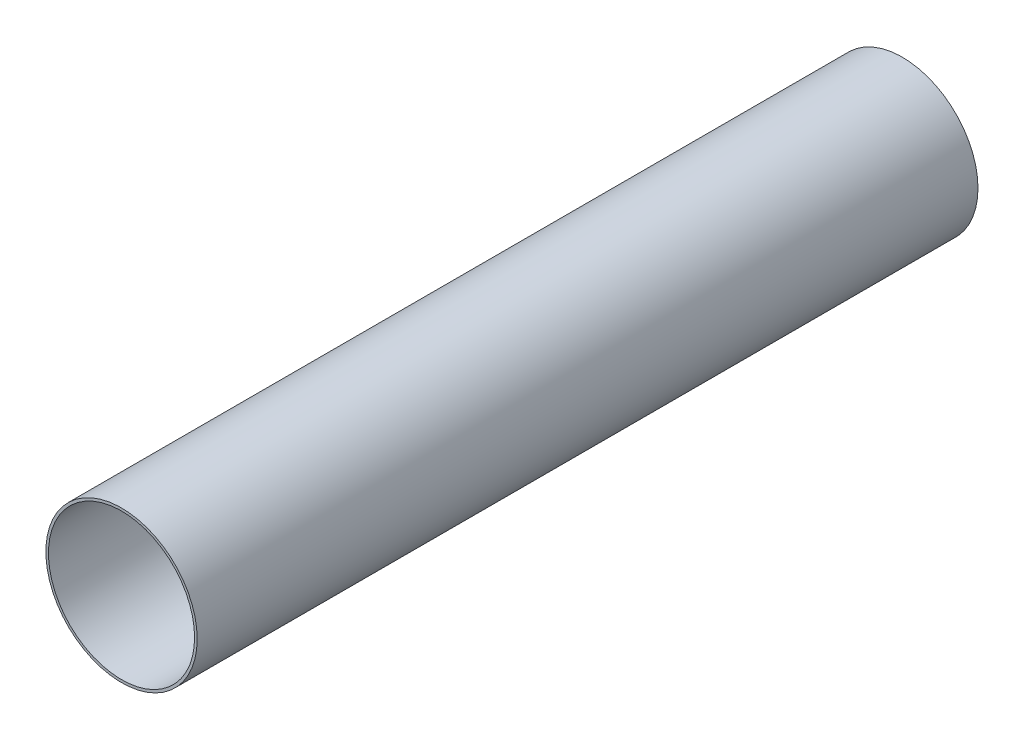
ISO-10303-21;
HEADER;
FILE_DESCRIPTION(('STEP AP214'),'2;1');
FILE_NAME('part.step','',(''),(''),'','','');
FILE_SCHEMA(('AUTOMOTIVE_DESIGN { 1 0 10303 214 1 1 1 1 }'));
ENDSEC;
DATA;
#1=APPLICATION_CONTEXT('core data for automotive mechanical design processes');
#2=APPLICATION_PROTOCOL_DEFINITION('international standard','automotive_design',2000,#1);
#3=PRODUCT_CONTEXT('',#1,'mechanical');
#4=PRODUCT('Part','Part','',(#3));
#5=PRODUCT_RELATED_PRODUCT_CATEGORY('part','',(#4));
#6=PRODUCT_DEFINITION_FORMATION('','',#4);
#7=PRODUCT_DEFINITION_CONTEXT('part definition',#1,'design');
#8=PRODUCT_DEFINITION('design','',#6,#7);
#9=PRODUCT_DEFINITION_SHAPE('','',#8);
#10=(LENGTH_UNIT() NAMED_UNIT(*) SI_UNIT(.MILLI.,.METRE.));
#11=(NAMED_UNIT(*) PLANE_ANGLE_UNIT() SI_UNIT($,.RADIAN.));
#12=(NAMED_UNIT(*) SI_UNIT($,.STERADIAN.) SOLID_ANGLE_UNIT());
#13=UNCERTAINTY_MEASURE_WITH_UNIT(LENGTH_MEASURE(1.E-05),#10,'distance_accuracy_value','');
#14=(GEOMETRIC_REPRESENTATION_CONTEXT(3) GLOBAL_UNCERTAINTY_ASSIGNED_CONTEXT((#13)) GLOBAL_UNIT_ASSIGNED_CONTEXT((#10,
#11,#12)) REPRESENTATION_CONTEXT('',''));
#15=CARTESIAN_POINT('',(0.,0.,0.));
#16=DIRECTION('',(0.,0.,1.));
#17=DIRECTION('',(1.,0.,0.));
#18=AXIS2_PLACEMENT_3D('',#15,#16,#17);
#19=CARTESIAN_POINT('',(0.,0.,1500.));
#20=DIRECTION('',(0.,0.,1.));
#21=DIRECTION('',(1.,0.,0.));
#22=AXIS2_PLACEMENT_3D('',#19,#20,#21);
#23=PLANE('',#22);
#24=CARTESIAN_POINT('',(0.,0.,1500.));
#25=DIRECTION('',(0.,0.,1.));
#26=DIRECTION('',(1.,0.,0.));
#27=AXIS2_PLACEMENT_3D('',#24,#25,#26);
#28=CIRCLE('',#27,145.37);
#29=CARTESIAN_POINT('',(145.37,0.,1500.));
#30=VERTEX_POINT('',#29);
#31=EDGE_CURVE('E10',#30,#30,#28,.T.);
#32=ORIENTED_EDGE('',*,*,#31,.T.);
#33=EDGE_LOOP('',(#32));
#34=FACE_BOUND('',#33,.T.);
#35=CARTESIAN_POINT('',(0.,0.,1500.));
#36=DIRECTION('',(0.,0.,1.));
#37=DIRECTION('',(1.,0.,0.));
#38=AXIS2_PLACEMENT_3D('',#35,#36,#37);
#39=CIRCLE('',#38,140.37);
#40=CARTESIAN_POINT('',(140.37,0.,1500.));
#41=VERTEX_POINT('',#40);
#42=EDGE_CURVE('E56',#41,#41,#39,.T.);
#43=ORIENTED_EDGE('',*,*,#42,.F.);
#44=EDGE_LOOP('',(#43));
#45=FACE_BOUND('',#44,.T.);
#46=ADVANCED_FACE('F43',(#34,#45),#23,.T.);
#47=CARTESIAN_POINT('',(0.,0.,0.));
#48=DIRECTION('',(0.,0.,1.));
#49=DIRECTION('',(1.,0.,0.));
#50=AXIS2_PLACEMENT_3D('',#47,#48,#49);
#51=PLANE('',#50);
#52=CARTESIAN_POINT('',(0.,0.,0.));
#53=DIRECTION('',(0.,0.,1.));
#54=DIRECTION('',(1.,0.,0.));
#55=AXIS2_PLACEMENT_3D('',#52,#53,#54);
#56=CIRCLE('',#55,145.37);
#57=CARTESIAN_POINT('',(145.37,0.,0.));
#58=VERTEX_POINT('',#57);
#59=EDGE_CURVE('E47',#58,#58,#56,.T.);
#60=ORIENTED_EDGE('',*,*,#59,.F.);
#61=EDGE_LOOP('',(#60));
#62=FACE_BOUND('',#61,.T.);
#63=CARTESIAN_POINT('',(0.,0.,0.));
#64=DIRECTION('',(0.,0.,1.));
#65=DIRECTION('',(1.,0.,0.));
#66=AXIS2_PLACEMENT_3D('',#63,#64,#65);
#67=CIRCLE('',#66,140.37);
#68=CARTESIAN_POINT('',(140.37,0.,0.));
#69=VERTEX_POINT('',#68);
#70=EDGE_CURVE('E58',#69,#69,#67,.T.);
#71=ORIENTED_EDGE('',*,*,#70,.T.);
#72=EDGE_LOOP('',(#71));
#73=FACE_BOUND('',#72,.T.);
#74=ADVANCED_FACE('F70',(#62,#73),#51,.F.);
#75=CARTESIAN_POINT('',(0.,0.,1500.));
#76=DIRECTION('',(0.,0.,-1.));
#77=DIRECTION('',(-1.,0.,0.));
#78=AXIS2_PLACEMENT_3D('',#75,#76,#77);
#79=CYLINDRICAL_SURFACE('',#78,145.37);
#80=ORIENTED_EDGE('',*,*,#31,.F.);
#81=EDGE_LOOP('',(#80));
#82=FACE_BOUND('',#81,.T.);
#83=ORIENTED_EDGE('',*,*,#59,.T.);
#84=EDGE_LOOP('',(#83));
#85=FACE_BOUND('',#84,.T.);
#86=ADVANCED_FACE('F45',(#82,#85),#79,.T.);
#87=CARTESIAN_POINT('',(0.,0.,1500.));
#88=DIRECTION('',(0.,0.,-1.));
#89=DIRECTION('',(-1.,0.,0.));
#90=AXIS2_PLACEMENT_3D('',#87,#88,#89);
#91=CYLINDRICAL_SURFACE('',#90,140.37);
#92=ORIENTED_EDGE('',*,*,#42,.T.);
#93=EDGE_LOOP('',(#92));
#94=FACE_BOUND('',#93,.T.);
#95=ORIENTED_EDGE('',*,*,#70,.F.);
#96=EDGE_LOOP('',(#95));
#97=FACE_BOUND('',#96,.T.);
#98=ADVANCED_FACE('F66',(#94,#97),#91,.F.);
#99=CLOSED_SHELL('',(#46,#74,#86,#98));
#100=MANIFOLD_SOLID_BREP('B2',#99);
#101=ADVANCED_BREP_SHAPE_REPRESENTATION('',(#18,#100),#14);
#102=SHAPE_DEFINITION_REPRESENTATION(#9,#101);
ENDSEC;
END-ISO-10303-21;
